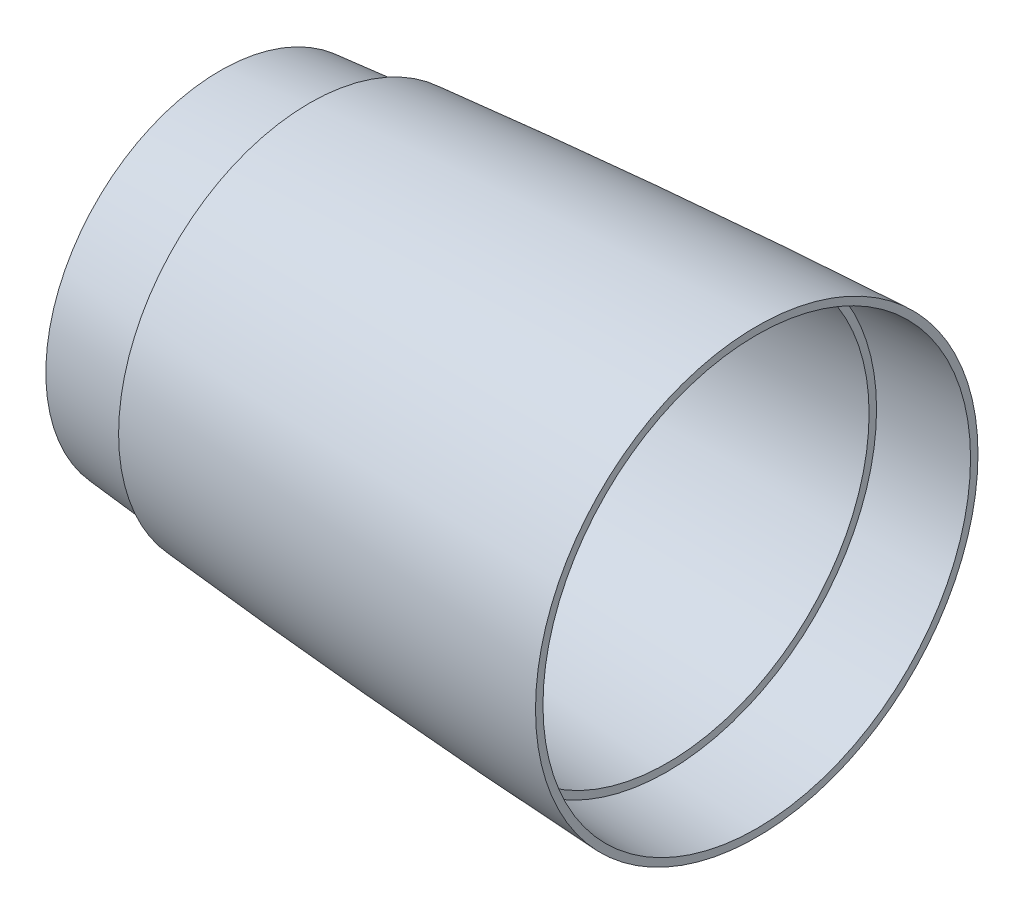
ISO-10303-21;
HEADER;
FILE_DESCRIPTION(('STEP AP214'),'2;1');
FILE_NAME('part.step','',(''),(''),'','','');
FILE_SCHEMA(('AUTOMOTIVE_DESIGN { 1 0 10303 214 1 1 1 1 }'));
ENDSEC;
DATA;
#1=APPLICATION_CONTEXT('core data for automotive mechanical design processes');
#2=APPLICATION_PROTOCOL_DEFINITION('international standard','automotive_design',2000,#1);
#3=PRODUCT_CONTEXT('',#1,'mechanical');
#4=PRODUCT('Part','Part','',(#3));
#5=PRODUCT_RELATED_PRODUCT_CATEGORY('part','',(#4));
#6=PRODUCT_DEFINITION_FORMATION('','',#4);
#7=PRODUCT_DEFINITION_CONTEXT('part definition',#1,'design');
#8=PRODUCT_DEFINITION('design','',#6,#7);
#9=PRODUCT_DEFINITION_SHAPE('','',#8);
#10=(LENGTH_UNIT() NAMED_UNIT(*) SI_UNIT(.MILLI.,.METRE.));
#11=(NAMED_UNIT(*) PLANE_ANGLE_UNIT() SI_UNIT($,.RADIAN.));
#12=(NAMED_UNIT(*) SI_UNIT($,.STERADIAN.) SOLID_ANGLE_UNIT());
#13=UNCERTAINTY_MEASURE_WITH_UNIT(LENGTH_MEASURE(1.E-05),#10,'distance_accuracy_value','');
#14=(GEOMETRIC_REPRESENTATION_CONTEXT(3) GLOBAL_UNCERTAINTY_ASSIGNED_CONTEXT((#13)) GLOBAL_UNIT_ASSIGNED_CONTEXT((#10,
#11,#12)) REPRESENTATION_CONTEXT('',''));
#15=CARTESIAN_POINT('',(0.,0.,0.));
#16=DIRECTION('',(0.,0.,1.));
#17=DIRECTION('',(1.,0.,0.));
#18=AXIS2_PLACEMENT_3D('',#15,#16,#17);
#19=CARTESIAN_POINT('',(0.,3557.29676158737,0.));
#20=DIRECTION('',(1.,0.,0.));
#21=DIRECTION('',(0.,0.,-1.));
#22=AXIS2_PLACEMENT_3D('',#19,#20,#21);
#23=DEGENERATE_TOROIDAL_SURFACE('',#22,3557.29676158737,3632.7,.F.);
#24=CARTESIAN_POINT('',(-319.999999999553,3557.29676158737,0.));
#25=DIRECTION('',(1.,0.,0.));
#26=DIRECTION('',(0.,0.,-1.));
#27=AXIS2_PLACEMENT_3D('',#24,#25,#26);
#28=CIRCLE('',#27,61.2815904730448);
#29=CARTESIAN_POINT('',(-319.999999999553,3557.29676158737,-61.2815904730448));
#30=VERTEX_POINT('',#29);
#31=EDGE_CURVE('E64',#30,#30,#28,.T.);
#32=ORIENTED_EDGE('',*,*,#31,.F.);
#33=EDGE_LOOP('',(#32));
#34=FACE_BOUND('',#33,.T.);
#35=CARTESIAN_POINT('',(-349.99999999953,3557.29676158737,0.));
#36=DIRECTION('',(1.,0.,0.));
#37=DIRECTION('',(0.,0.,-1.));
#38=AXIS2_PLACEMENT_3D('',#35,#36,#37);
#39=CIRCLE('',#38,58.5031900139779);
#40=CARTESIAN_POINT('',(-349.99999999953,3557.29676158737,-58.5031900139779));
#41=VERTEX_POINT('',#40);
#42=EDGE_CURVE('E10',#41,#41,#39,.T.);
#43=ORIENTED_EDGE('',*,*,#42,.T.);
#44=EDGE_LOOP('',(#43));
#45=FACE_BOUND('',#44,.T.);
#46=ADVANCED_FACE('F36',(#34,#45),#23,.F.);
#47=CARTESIAN_POINT('',(-349.99999999953,0.,0.));
#48=DIRECTION('',(-1.,0.,0.));
#49=DIRECTION('',(0.,0.,1.));
#50=AXIS2_PLACEMENT_3D('',#47,#48,#49);
#51=PLANE('',#50);
#52=CARTESIAN_POINT('',(-349.99999999953,3557.29676158737,0.));
#53=DIRECTION('',(1.,0.,0.));
#54=DIRECTION('',(0.,0.,-1.));
#55=AXIS2_PLACEMENT_3D('',#52,#53,#54);
#56=CIRCLE('',#55,56.2929010611599);
#57=CARTESIAN_POINT('',(-349.99999999953,3557.29676158737,-56.2929010611599));
#58=VERTEX_POINT('',#57);
#59=EDGE_CURVE('E42',#58,#58,#56,.T.);
#60=ORIENTED_EDGE('',*,*,#59,.T.);
#61=EDGE_LOOP('',(#60));
#62=FACE_BOUND('',#61,.T.);
#63=ORIENTED_EDGE('',*,*,#42,.F.);
#64=EDGE_LOOP('',(#63));
#65=FACE_BOUND('',#64,.T.);
#66=ADVANCED_FACE('F72',(#62,#65),#51,.T.);
#67=CARTESIAN_POINT('',(0.,3557.29676158737,0.));
#68=DIRECTION('',(1.,0.,0.));
#69=DIRECTION('',(0.,0.,-1.));
#70=AXIS2_PLACEMENT_3D('',#67,#68,#69);
#71=DEGENERATE_TOROIDAL_SURFACE('',#70,3557.29676158737,3630.5,.F.);
#72=ORIENTED_EDGE('',*,*,#59,.F.);
#73=EDGE_LOOP('',(#72));
#74=FACE_BOUND('',#73,.T.);
#75=CARTESIAN_POINT('',(-199.99999999966,3557.29676158737,0.));
#76=DIRECTION('',(1.,0.,0.));
#77=DIRECTION('',(0.,0.,-1.));
#78=AXIS2_PLACEMENT_3D('',#75,#76,#77);
#79=CIRCLE('',#78,67.6901694235714);
#80=CARTESIAN_POINT('',(-199.99999999966,3557.29676158737,-67.6901694235714));
#81=VERTEX_POINT('',#80);
#82=EDGE_CURVE('E46',#81,#81,#79,.T.);
#83=ORIENTED_EDGE('',*,*,#82,.T.);
#84=EDGE_LOOP('',(#83));
#85=FACE_BOUND('',#84,.T.);
#86=ADVANCED_FACE('F76',(#74,#85),#71,.T.);
#87=CARTESIAN_POINT('',(-199.99999999966,0.,0.));
#88=DIRECTION('',(-1.,0.,0.));
#89=DIRECTION('',(0.,0.,1.));
#90=AXIS2_PLACEMENT_3D('',#87,#88,#89);
#91=PLANE('',#90);
#92=ORIENTED_EDGE('',*,*,#82,.F.);
#93=EDGE_LOOP('',(#92));
#94=FACE_BOUND('',#93,.T.);
#95=CARTESIAN_POINT('',(-199.99999999966,3557.29676158737,0.));
#96=DIRECTION('',(1.,0.,0.));
#97=DIRECTION('',(0.,0.,-1.));
#98=AXIS2_PLACEMENT_3D('',#95,#96,#97);
#99=CIRCLE('',#98,70.1939689314721);
#100=CARTESIAN_POINT('',(-199.99999999966,3557.29676158737,-70.1939689314721));
#101=VERTEX_POINT('',#100);
#102=EDGE_CURVE('E50',#101,#101,#99,.T.);
#103=ORIENTED_EDGE('',*,*,#102,.T.);
#104=EDGE_LOOP('',(#103));
#105=FACE_BOUND('',#104,.T.);
#106=ADVANCED_FACE('F80',(#94,#105),#91,.F.);
#107=CARTESIAN_POINT('',(0.,3557.29676158737,0.));
#108=DIRECTION('',(1.,0.,0.));
#109=DIRECTION('',(0.,0.,-1.));
#110=AXIS2_PLACEMENT_3D('',#107,#108,#109);
#111=DEGENERATE_TOROIDAL_SURFACE('',#110,3557.29676158737,3633.,.F.);
#112=ORIENTED_EDGE('',*,*,#102,.F.);
#113=EDGE_LOOP('',(#112));
#114=FACE_BOUND('',#113,.T.);
#115=CARTESIAN_POINT('',(-169.99999999966,3557.29676158737,0.));
#116=DIRECTION('',(1.,0.,0.));
#117=DIRECTION('',(0.,0.,-1.));
#118=AXIS2_PLACEMENT_3D('',#115,#116,#117);
#119=CIRCLE('',#118,71.7236296477224);
#120=CARTESIAN_POINT('',(-169.99999999966,3557.29676158737,-71.7236296477224));
#121=VERTEX_POINT('',#120);
#122=EDGE_CURVE('E55',#121,#121,#119,.T.);
#123=ORIENTED_EDGE('',*,*,#122,.T.);
#124=EDGE_LOOP('',(#123));
#125=FACE_BOUND('',#124,.T.);
#126=ADVANCED_FACE('F87',(#114,#125),#111,.T.);
#127=CARTESIAN_POINT('',(-169.99999999966,0.,0.));
#128=DIRECTION('',(1.,0.,0.));
#129=DIRECTION('',(0.,0.,-1.));
#130=AXIS2_PLACEMENT_3D('',#127,#128,#129);
#131=PLANE('',#130);
#132=CARTESIAN_POINT('',(-169.99999999966,3557.29676158737,0.));
#133=DIRECTION('',(1.,0.,0.));
#134=DIRECTION('',(0.,0.,-1.));
#135=AXIS2_PLACEMENT_3D('',#132,#133,#134);
#136=CIRCLE('',#135,74.226369276607);
#137=CARTESIAN_POINT('',(-169.99999999966,3557.29676158737,-74.226369276607));
#138=VERTEX_POINT('',#137);
#139=EDGE_CURVE('E58',#138,#138,#136,.T.);
#140=ORIENTED_EDGE('',*,*,#139,.T.);
#141=EDGE_LOOP('',(#140));
#142=FACE_BOUND('',#141,.T.);
#143=ORIENTED_EDGE('',*,*,#122,.F.);
#144=EDGE_LOOP('',(#143));
#145=FACE_BOUND('',#144,.T.);
#146=ADVANCED_FACE('F91',(#142,#145),#131,.T.);
#147=CARTESIAN_POINT('',(0.,3557.29676158737,0.));
#148=DIRECTION('',(1.,0.,0.));
#149=DIRECTION('',(0.,0.,-1.));
#150=AXIS2_PLACEMENT_3D('',#147,#148,#149);
#151=DEGENERATE_TOROIDAL_SURFACE('',#150,3557.29676158737,3635.5,.F.);
#152=CARTESIAN_POINT('',(-319.999999999553,3557.29676158737,0.));
#153=DIRECTION('',(1.,0.,0.));
#154=DIRECTION('',(0.,0.,-1.));
#155=AXIS2_PLACEMENT_3D('',#152,#153,#154);
#156=CIRCLE('',#155,64.0925091208029);
#157=CARTESIAN_POINT('',(-319.999999999553,3557.29676158737,-64.0925091208029));
#158=VERTEX_POINT('',#157);
#159=EDGE_CURVE('E61',#158,#158,#156,.T.);
#160=ORIENTED_EDGE('',*,*,#159,.T.);
#161=EDGE_LOOP('',(#160));
#162=FACE_BOUND('',#161,.T.);
#163=ORIENTED_EDGE('',*,*,#139,.F.);
#164=EDGE_LOOP('',(#163));
#165=FACE_BOUND('',#164,.T.);
#166=ADVANCED_FACE('F95',(#162,#165),#151,.F.);
#167=CARTESIAN_POINT('',(-319.999999999553,0.,0.));
#168=DIRECTION('',(-1.,0.,0.));
#169=DIRECTION('',(0.,0.,1.));
#170=AXIS2_PLACEMENT_3D('',#167,#168,#169);
#171=PLANE('',#170);
#172=ORIENTED_EDGE('',*,*,#31,.T.);
#173=EDGE_LOOP('',(#172));
#174=FACE_BOUND('',#173,.T.);
#175=ORIENTED_EDGE('',*,*,#159,.F.);
#176=EDGE_LOOP('',(#175));
#177=FACE_BOUND('',#176,.T.);
#178=ADVANCED_FACE('F68',(#174,#177),#171,.T.);
#179=CLOSED_SHELL('',(#46,#66,#86,#106,#126,#146,#166,#178));
#180=MANIFOLD_SOLID_BREP('B2',#179);
#181=ADVANCED_BREP_SHAPE_REPRESENTATION('',(#18,#180),#14);
#182=SHAPE_DEFINITION_REPRESENTATION(#9,#181);
ENDSEC;
END-ISO-10303-21;
